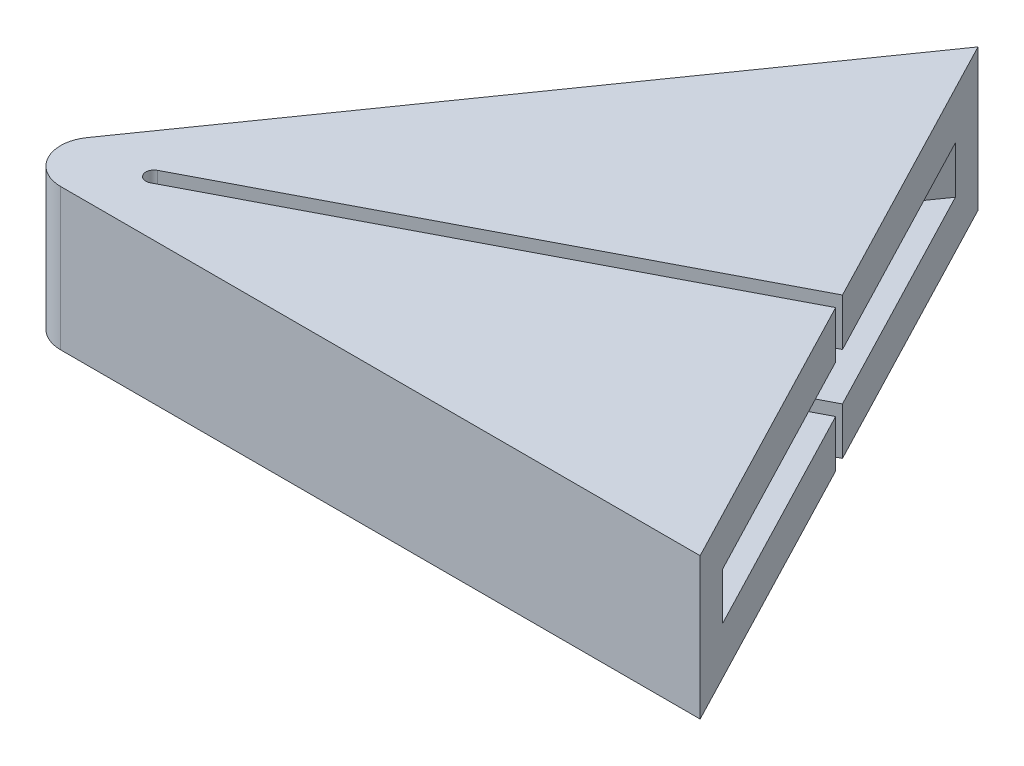
ISO-10303-21;
HEADER;
FILE_DESCRIPTION(('STEP AP214'),'2;1');
FILE_NAME('part.step','',(''),(''),'','','');
FILE_SCHEMA(('AUTOMOTIVE_DESIGN { 1 0 10303 214 1 1 1 1 }'));
ENDSEC;
DATA;
#1=APPLICATION_CONTEXT('core data for automotive mechanical design processes');
#2=APPLICATION_PROTOCOL_DEFINITION('international standard','automotive_design',2000,#1);
#3=PRODUCT_CONTEXT('',#1,'mechanical');
#4=PRODUCT('Part','Part','',(#3));
#5=PRODUCT_RELATED_PRODUCT_CATEGORY('part','',(#4));
#6=PRODUCT_DEFINITION_FORMATION('','',#4);
#7=PRODUCT_DEFINITION_CONTEXT('part definition',#1,'design');
#8=PRODUCT_DEFINITION('design','',#6,#7);
#9=PRODUCT_DEFINITION_SHAPE('','',#8);
#10=(LENGTH_UNIT() NAMED_UNIT(*) SI_UNIT(.MILLI.,.METRE.));
#11=(NAMED_UNIT(*) PLANE_ANGLE_UNIT() SI_UNIT($,.RADIAN.));
#12=(NAMED_UNIT(*) SI_UNIT($,.STERADIAN.) SOLID_ANGLE_UNIT());
#13=UNCERTAINTY_MEASURE_WITH_UNIT(LENGTH_MEASURE(1.E-05),#10,'distance_accuracy_value','');
#14=(GEOMETRIC_REPRESENTATION_CONTEXT(3) GLOBAL_UNCERTAINTY_ASSIGNED_CONTEXT((#13)) GLOBAL_UNIT_ASSIGNED_CONTEXT((#10,
#11,#12)) REPRESENTATION_CONTEXT('',''));
#15=CARTESIAN_POINT('',(0.,0.,0.));
#16=DIRECTION('',(0.,0.,1.));
#17=DIRECTION('',(1.,0.,0.));
#18=AXIS2_PLACEMENT_3D('',#15,#16,#17);
#19=CARTESIAN_POINT('',(23.761653898545,6.,-11.9837513627552));
#20=DIRECTION('',(-0.887010833178221,0.,0.461748613235035));
#21=DIRECTION('',(0.461748613235035,0.,0.887010833178221));
#22=AXIS2_PLACEMENT_3D('',#19,#20,#21);
#23=PLANE('',#22);
#24=DIRECTION('',(-0.461748613235035,0.,-0.887010833178221));
#25=VECTOR('',#24,1.);
#26=CARTESIAN_POINT('',(23.761653898545,2.,-11.9837513627552));
#27=LINE('',#26,#25);
#28=CARTESIAN_POINT('',(28.9588658988965,2.,-2.));
#29=VERTEX_POINT('',#28);
#30=CARTESIAN_POINT('',(23.761653898545,2.,-11.9837513627552));
#31=VERTEX_POINT('',#30);
#32=EDGE_CURVE('E179',#29,#31,#27,.T.);
#33=ORIENTED_EDGE('',*,*,#32,.F.);
#34=DIRECTION('',(0.,-1.,0.));
#35=VECTOR('',#34,1.);
#36=CARTESIAN_POINT('',(28.9588658988965,6.,-2.));
#37=LINE('',#36,#35);
#38=CARTESIAN_POINT('',(28.9588658988965,4.,-2.));
#39=VERTEX_POINT('',#38);
#40=EDGE_CURVE('E161',#39,#29,#37,.T.);
#41=ORIENTED_EDGE('',*,*,#40,.F.);
#42=DIRECTION('',(-0.461748613235035,0.,-0.887010833178221));
#43=VECTOR('',#42,1.);
#44=CARTESIAN_POINT('',(23.761653898545,4.,-11.9837513627552));
#45=LINE('',#44,#43);
#46=CARTESIAN_POINT('',(23.761653898545,4.,-11.9837513627552));
#47=VERTEX_POINT('',#46);
#48=EDGE_CURVE('E205',#39,#47,#45,.T.);
#49=ORIENTED_EDGE('',*,*,#48,.T.);
#50=DIRECTION('',(0.,-1.,0.));
#51=VECTOR('',#50,1.);
#52=CARTESIAN_POINT('',(23.761653898545,6.,-11.9837513627552));
#53=LINE('',#52,#51);
#54=CARTESIAN_POINT('',(23.761653898545,6.,-11.9837513627552));
#55=VERTEX_POINT('',#54);
#56=EDGE_CURVE('E304',#55,#47,#53,.T.);
#57=ORIENTED_EDGE('',*,*,#56,.F.);
#58=DIRECTION('',(-0.461748613235035,0.,-0.887010833178221));
#59=VECTOR('',#58,1.);
#60=CARTESIAN_POINT('',(23.761653898545,6.,-11.9837513627552));
#61=LINE('',#60,#59);
#62=CARTESIAN_POINT('',(30.,6.,0.));
#63=VERTEX_POINT('',#62);
#64=EDGE_CURVE('E244',#63,#55,#61,.T.);
#65=ORIENTED_EDGE('',*,*,#64,.F.);
#66=DIRECTION('',(0.,-1.,0.));
#67=VECTOR('',#66,1.);
#68=CARTESIAN_POINT('',(30.,6.,0.));
#69=LINE('',#68,#67);
#70=CARTESIAN_POINT('',(30.,0.,0.));
#71=VERTEX_POINT('',#70);
#72=EDGE_CURVE('E308',#63,#71,#69,.T.);
#73=ORIENTED_EDGE('',*,*,#72,.T.);
#74=DIRECTION('',(-0.461748613235035,0.,-0.887010833178221));
#75=VECTOR('',#74,1.);
#76=CARTESIAN_POINT('',(23.761653898545,0.,-11.9837513627552));
#77=LINE('',#76,#75);
#78=CARTESIAN_POINT('',(23.761653898545,0.,-11.9837513627552));
#79=VERTEX_POINT('',#78);
#80=EDGE_CURVE('E266',#71,#79,#77,.T.);
#81=ORIENTED_EDGE('',*,*,#80,.T.);
#82=EDGE_CURVE('E186',#31,#79,#53,.T.);
#83=ORIENTED_EDGE('',*,*,#82,.F.);
#84=EDGE_LOOP('',(#33,#41,#49,#57,#65,#73,#81,#83));
#85=FACE_BOUND('',#84,.T.);
#86=ADVANCED_FACE('F47',(#85),#23,.F.);
#87=CARTESIAN_POINT('',(4.6573191181392,6.,-2.0386641533662));
#88=DIRECTION('',(0.461748613235035,0.,0.887010833178221));
#89=DIRECTION('',(0.887010833178221,0.,-0.461748613235035));
#90=AXIS2_PLACEMENT_3D('',#87,#88,#89);
#91=PLANE('',#90);
#92=DIRECTION('',(-0.887010833178221,0.,0.461748613235035));
#93=VECTOR('',#92,1.);
#94=CARTESIAN_POINT('',(4.6573191181392,2.,-2.0386641533662));
#95=LINE('',#94,#93);
#96=CARTESIAN_POINT('',(4.6573191181392,2.,-2.0386641533662));
#97=VERTEX_POINT('',#96);
#98=EDGE_CURVE('E188',#31,#97,#95,.T.);
#99=ORIENTED_EDGE('',*,*,#98,.F.);
#100=ORIENTED_EDGE('',*,*,#82,.T.);
#101=DIRECTION('',(-0.887010833178221,0.,0.461748613235035));
#102=VECTOR('',#101,1.);
#103=CARTESIAN_POINT('',(4.6573191181392,0.,-2.0386641533662));
#104=LINE('',#103,#102);
#105=CARTESIAN_POINT('',(4.6573191181392,0.,-2.0386641533662));
#106=VERTEX_POINT('',#105);
#107=EDGE_CURVE('E269',#79,#106,#104,.T.);
#108=ORIENTED_EDGE('',*,*,#107,.T.);
#109=DIRECTION('',(0.,-1.,0.));
#110=VECTOR('',#109,1.);
#111=CARTESIAN_POINT('',(4.6573191181392,6.,-2.0386641533662));
#112=LINE('',#111,#110);
#113=EDGE_CURVE('E299',#97,#106,#112,.T.);
#114=ORIENTED_EDGE('',*,*,#113,.F.);
#115=EDGE_LOOP('',(#99,#100,#108,#114));
#116=FACE_BOUND('',#115,.T.);
#117=ADVANCED_FACE('F381',(#116),#91,.F.);
#118=CARTESIAN_POINT('',(23.4456391919863,6.,-12.5908099659146));
#119=DIRECTION('',(-0.461748613235035,0.,-0.887010833178221));
#120=DIRECTION('',(-0.887010833178221,0.,0.461748613235035));
#121=AXIS2_PLACEMENT_3D('',#118,#119,#120);
#122=PLANE('',#121);
#123=DIRECTION('',(0.887010833178221,0.,-0.461748613235035));
#124=VECTOR('',#123,1.);
#125=CARTESIAN_POINT('',(23.4456391919863,2.,-12.5908099659146));
#126=LINE('',#125,#124);
#127=CARTESIAN_POINT('',(4.34130441158048,2.,-2.64572275652553));
#128=VERTEX_POINT('',#127);
#129=CARTESIAN_POINT('',(23.4456391919863,2.,-12.5908099659146));
#130=VERTEX_POINT('',#129);
#131=EDGE_CURVE('E191',#128,#130,#126,.T.);
#132=ORIENTED_EDGE('',*,*,#131,.F.);
#133=DIRECTION('',(0.,-1.,0.));
#134=VECTOR('',#133,1.);
#135=CARTESIAN_POINT('',(4.34130441158048,6.,-2.64572275652553));
#136=LINE('',#135,#134);
#137=CARTESIAN_POINT('',(4.34130441158048,0.,-2.64572275652553));
#138=VERTEX_POINT('',#137);
#139=EDGE_CURVE('E294',#128,#138,#136,.T.);
#140=ORIENTED_EDGE('',*,*,#139,.T.);
#141=DIRECTION('',(0.887010833178221,0.,-0.461748613235035));
#142=VECTOR('',#141,1.);
#143=CARTESIAN_POINT('',(23.4456391919863,0.,-12.5908099659146));
#144=LINE('',#143,#142);
#145=CARTESIAN_POINT('',(23.4456391919863,0.,-12.5908099659146));
#146=VERTEX_POINT('',#145);
#147=EDGE_CURVE('E277',#138,#146,#144,.T.);
#148=ORIENTED_EDGE('',*,*,#147,.T.);
#149=DIRECTION('',(0.,-1.,0.));
#150=VECTOR('',#149,1.);
#151=CARTESIAN_POINT('',(23.4456391919863,6.,-12.5908099659146));
#152=LINE('',#151,#150);
#153=EDGE_CURVE('E289',#130,#146,#152,.T.);
#154=ORIENTED_EDGE('',*,*,#153,.F.);
#155=EDGE_LOOP('',(#132,#140,#148,#154));
#156=FACE_BOUND('',#155,.T.);
#157=ADVANCED_FACE('F385',(#156),#122,.F.);
#158=CARTESIAN_POINT('',(17.2072930905313,6.,-24.5745613286698));
#159=DIRECTION('',(-0.887010833178221,0.,0.461748613235035));
#160=DIRECTION('',(0.461748613235035,0.,0.887010833178221));
#161=AXIS2_PLACEMENT_3D('',#158,#159,#160);
#162=PLANE('',#161);
#163=DIRECTION('',(-0.461748613235035,0.,-0.887010833178221));
#164=VECTOR('',#163,1.);
#165=CARTESIAN_POINT('',(17.2072930905313,2.,-24.5745613286698));
#166=LINE('',#165,#164);
#167=CARTESIAN_POINT('',(18.2484271916348,2.,-22.5745613286698));
#168=VERTEX_POINT('',#167);
#169=EDGE_CURVE('E227',#130,#168,#166,.T.);
#170=ORIENTED_EDGE('',*,*,#169,.F.);
#171=ORIENTED_EDGE('',*,*,#153,.T.);
#172=DIRECTION('',(-0.461748613235035,0.,-0.887010833178221));
#173=VECTOR('',#172,1.);
#174=CARTESIAN_POINT('',(17.2072930905313,0.,-24.5745613286698));
#175=LINE('',#174,#173);
#176=CARTESIAN_POINT('',(17.2072930905313,0.,-24.5745613286698));
#177=VERTEX_POINT('',#176);
#178=EDGE_CURVE('E281',#146,#177,#175,.T.);
#179=ORIENTED_EDGE('',*,*,#178,.T.);
#180=DIRECTION('',(0.,-1.,0.));
#181=VECTOR('',#180,1.);
#182=CARTESIAN_POINT('',(17.2072930905313,6.,-24.5745613286698));
#183=LINE('',#182,#181);
#184=CARTESIAN_POINT('',(17.2072930905313,6.,-24.5745613286698));
#185=VERTEX_POINT('',#184);
#186=EDGE_CURVE('E263',#185,#177,#183,.T.);
#187=ORIENTED_EDGE('',*,*,#186,.F.);
#188=DIRECTION('',(-0.461748613235035,0.,-0.887010833178221));
#189=VECTOR('',#188,1.);
#190=CARTESIAN_POINT('',(17.2072930905313,6.,-24.5745613286698));
#191=LINE('',#190,#189);
#192=CARTESIAN_POINT('',(23.4456391919863,6.,-12.5908099659146));
#193=VERTEX_POINT('',#192);
#194=EDGE_CURVE('E257',#193,#185,#191,.T.);
#195=ORIENTED_EDGE('',*,*,#194,.F.);
#196=CARTESIAN_POINT('',(23.4456391919863,4.,-12.5908099659146));
#197=VERTEX_POINT('',#196);
#198=EDGE_CURVE('E290',#193,#197,#152,.T.);
#199=ORIENTED_EDGE('',*,*,#198,.T.);
#200=DIRECTION('',(-0.461748613235035,0.,-0.887010833178221));
#201=VECTOR('',#200,1.);
#202=CARTESIAN_POINT('',(17.2072930905313,4.,-24.5745613286698));
#203=LINE('',#202,#201);
#204=CARTESIAN_POINT('',(18.2484271916348,4.,-22.5745613286698));
#205=VERTEX_POINT('',#204);
#206=EDGE_CURVE('E214',#197,#205,#203,.T.);
#207=ORIENTED_EDGE('',*,*,#206,.T.);
#208=DIRECTION('',(0.,-1.,0.));
#209=VECTOR('',#208,1.);
#210=CARTESIAN_POINT('',(18.2484271916348,6.,-22.5745613286698));
#211=LINE('',#210,#209);
#212=EDGE_CURVE('E208',#205,#168,#211,.T.);
#213=ORIENTED_EDGE('',*,*,#212,.T.);
#214=EDGE_LOOP('',(#170,#171,#179,#187,#195,#199,#207,#213));
#215=FACE_BOUND('',#214,.T.);
#216=ADVANCED_FACE('F387',(#215),#162,.F.);
#217=CARTESIAN_POINT('',(0.,6.,0.));
#218=DIRECTION('',(0.,0.,-1.));
#219=DIRECTION('',(-1.,0.,0.));
#220=AXIS2_PLACEMENT_3D('',#217,#218,#219);
#221=PLANE('',#220);
#222=DIRECTION('',(1.,0.,0.));
#223=VECTOR('',#222,1.);
#224=CARTESIAN_POINT('',(0.,6.,0.));
#225=LINE('',#224,#223);
#226=CARTESIAN_POINT('',(2.88147319045674,6.,0.));
#227=VERTEX_POINT('',#226);
#228=EDGE_CURVE('E241',#227,#63,#225,.T.);
#229=ORIENTED_EDGE('',*,*,#228,.F.);
#230=DIRECTION('',(0.,-1.,0.));
#231=VECTOR('',#230,1.);
#232=CARTESIAN_POINT('',(2.88147319045674,6.,0.));
#233=LINE('',#232,#231);
#234=CARTESIAN_POINT('',(2.88147319045674,0.,0.));
#235=VERTEX_POINT('',#234);
#236=EDGE_CURVE('E312',#227,#235,#233,.T.);
#237=ORIENTED_EDGE('',*,*,#236,.T.);
#238=DIRECTION('',(1.,0.,0.));
#239=VECTOR('',#238,1.);
#240=CARTESIAN_POINT('',(0.,0.,0.));
#241=LINE('',#240,#239);
#242=EDGE_CURVE('E240',#235,#71,#241,.T.);
#243=ORIENTED_EDGE('',*,*,#242,.T.);
#244=ORIENTED_EDGE('',*,*,#72,.F.);
#245=EDGE_LOOP('',(#229,#237,#243,#244));
#246=FACE_BOUND('',#245,.T.);
#247=ADVANCED_FACE('F372',(#246),#221,.F.);
#248=ORIENTED_EDGE('',*,*,#56,.T.);
#249=DIRECTION('',(-0.887010833178221,0.,0.461748613235035));
#250=VECTOR('',#249,1.);
#251=CARTESIAN_POINT('',(4.6573191181392,4.,-2.0386641533662));
#252=LINE('',#251,#250);
#253=CARTESIAN_POINT('',(4.6573191181392,4.,-2.0386641533662));
#254=VERTEX_POINT('',#253);
#255=EDGE_CURVE('E200',#47,#254,#252,.T.);
#256=ORIENTED_EDGE('',*,*,#255,.T.);
#257=CARTESIAN_POINT('',(4.6573191181392,6.,-2.0386641533662));
#258=VERTEX_POINT('',#257);
#259=EDGE_CURVE('E300',#258,#254,#112,.T.);
#260=ORIENTED_EDGE('',*,*,#259,.F.);
#261=DIRECTION('',(-0.887010833178221,0.,0.461748613235035));
#262=VECTOR('',#261,1.);
#263=CARTESIAN_POINT('',(4.6573191181392,6.,-2.0386641533662));
#264=LINE('',#263,#262);
#265=EDGE_CURVE('E248',#55,#258,#264,.T.);
#266=ORIENTED_EDGE('',*,*,#265,.F.);
#267=EDGE_LOOP('',(#248,#256,#260,#266));
#268=FACE_BOUND('',#267,.T.);
#269=ADVANCED_FACE('F363',(#268),#91,.F.);
#270=CARTESIAN_POINT('',(4.49931176485984,6.,-2.34219345494587));
#271=DIRECTION('',(0.,-1.,0.));
#272=DIRECTION('',(0.,0.,-1.));
#273=AXIS2_PLACEMENT_3D('',#270,#271,#272);
#274=CYLINDRICAL_SURFACE('',#273,0.342193454945866);
#275=CARTESIAN_POINT('',(4.49931176485984,0.,-2.34219345494587));
#276=DIRECTION('',(0.,-1.,0.));
#277=DIRECTION('',(0.,0.,1.));
#278=AXIS2_PLACEMENT_3D('',#275,#276,#277);
#279=CIRCLE('',#278,0.342193454945866);
#280=EDGE_CURVE('E273',#106,#138,#279,.T.);
#281=ORIENTED_EDGE('',*,*,#280,.T.);
#282=ORIENTED_EDGE('',*,*,#139,.F.);
#283=DIRECTION('',(0.,-1.,0.));
#284=VECTOR('',#283,1.);
#285=CARTESIAN_POINT('',(4.34130441158048,6.,-2.64572275652553));
#286=LINE('',#285,#284);
#287=CARTESIAN_POINT('',(4.34130441158048,4.,-2.64572275652553));
#288=VERTEX_POINT('',#287);
#289=EDGE_CURVE('E212',#288,#128,#286,.T.);
#290=ORIENTED_EDGE('',*,*,#289,.F.);
#291=CARTESIAN_POINT('',(4.34130441158048,6.,-2.64572275652553));
#292=VERTEX_POINT('',#291);
#293=EDGE_CURVE('E295',#292,#288,#136,.T.);
#294=ORIENTED_EDGE('',*,*,#293,.F.);
#295=CARTESIAN_POINT('',(4.49931176485984,6.,-2.34219345494587));
#296=DIRECTION('',(0.,-1.,0.));
#297=DIRECTION('',(0.,0.,1.));
#298=AXIS2_PLACEMENT_3D('',#295,#296,#297);
#299=CIRCLE('',#298,0.342193454945866);
#300=EDGE_CURVE('E251',#258,#292,#299,.T.);
#301=ORIENTED_EDGE('',*,*,#300,.F.);
#302=ORIENTED_EDGE('',*,*,#259,.T.);
#303=DIRECTION('',(0.,-1.,0.));
#304=VECTOR('',#303,1.);
#305=CARTESIAN_POINT('',(4.6573191181392,6.,-2.0386641533662));
#306=LINE('',#305,#304);
#307=EDGE_CURVE('E173',#254,#97,#306,.T.);
#308=ORIENTED_EDGE('',*,*,#307,.T.);
#309=ORIENTED_EDGE('',*,*,#113,.T.);
#310=EDGE_LOOP('',(#281,#282,#290,#294,#301,#302,#308,#309));
#311=FACE_BOUND('',#310,.T.);
#312=ADVANCED_FACE('F349',(#311),#274,.F.);
#313=ORIENTED_EDGE('',*,*,#293,.T.);
#314=DIRECTION('',(0.887010833178221,0.,-0.461748613235035));
#315=VECTOR('',#314,1.);
#316=CARTESIAN_POINT('',(23.4456391919863,4.,-12.5908099659146));
#317=LINE('',#316,#315);
#318=EDGE_CURVE('E204',#288,#197,#317,.T.);
#319=ORIENTED_EDGE('',*,*,#318,.T.);
#320=ORIENTED_EDGE('',*,*,#198,.F.);
#321=DIRECTION('',(0.887010833178221,0.,-0.461748613235035));
#322=VECTOR('',#321,1.);
#323=CARTESIAN_POINT('',(23.4456391919863,6.,-12.5908099659146));
#324=LINE('',#323,#322);
#325=EDGE_CURVE('E254',#292,#193,#324,.T.);
#326=ORIENTED_EDGE('',*,*,#325,.F.);
#327=EDGE_LOOP('',(#313,#319,#320,#326));
#328=FACE_BOUND('',#327,.T.);
#329=ADVANCED_FACE('F353',(#328),#122,.F.);
#330=CARTESIAN_POINT('',(0.,6.,0.));
#331=DIRECTION('',(0.819152044288993,0.,0.573576436351044));
#332=DIRECTION('',(0.573576436351044,0.,-0.819152044288993));
#333=AXIS2_PLACEMENT_3D('',#330,#331,#332);
#334=PLANE('',#333);
#335=DIRECTION('',(-0.573576436351044,0.,0.819152044288993));
#336=VECTOR('',#335,1.);
#337=CARTESIAN_POINT('',(0.,0.,0.));
#338=LINE('',#337,#336);
#339=CARTESIAN_POINT('',(1.65274512402325,0.,-2.36036465452657));
#340=VERTEX_POINT('',#339);
#341=EDGE_CURVE('E245',#177,#340,#338,.T.);
#342=ORIENTED_EDGE('',*,*,#341,.T.);
#343=DIRECTION('',(0.,-1.,0.));
#344=VECTOR('',#343,1.);
#345=CARTESIAN_POINT('',(1.65274512402325,6.,-2.36036465452657));
#346=LINE('',#345,#344);
#347=CARTESIAN_POINT('',(1.65274512402325,6.,-2.36036465452657));
#348=VERTEX_POINT('',#347);
#349=EDGE_CURVE('E56',#340,#348,#346,.F.);
#350=ORIENTED_EDGE('',*,*,#349,.T.);
#351=DIRECTION('',(-0.573576436351044,0.,0.819152044288993));
#352=VECTOR('',#351,1.);
#353=CARTESIAN_POINT('',(0.,6.,0.));
#354=LINE('',#353,#352);
#355=EDGE_CURVE('E260',#185,#348,#354,.T.);
#356=ORIENTED_EDGE('',*,*,#355,.F.);
#357=ORIENTED_EDGE('',*,*,#186,.T.);
#358=EDGE_LOOP('',(#342,#350,#356,#357));
#359=FACE_BOUND('',#358,.T.);
#360=ADVANCED_FACE('F421',(#359),#334,.F.);
#361=CARTESIAN_POINT('',(4.49931176485984,6.,-2.34219345494587));
#362=DIRECTION('',(0.,1.,0.));
#363=DIRECTION('',(0.,0.,1.));
#364=AXIS2_PLACEMENT_3D('',#361,#362,#363);
#365=PLANE('',#364);
#366=ORIENTED_EDGE('',*,*,#355,.T.);
#367=CARTESIAN_POINT('',(2.88147319045674,6.,-1.5));
#368=DIRECTION('',(0.,1.,0.));
#369=DIRECTION('',(0.,0.,1.));
#370=AXIS2_PLACEMENT_3D('',#367,#368,#369);
#371=CIRCLE('',#370,1.5);
#372=EDGE_CURVE('E11',#348,#227,#371,.T.);
#373=ORIENTED_EDGE('',*,*,#372,.T.);
#374=ORIENTED_EDGE('',*,*,#228,.T.);
#375=ORIENTED_EDGE('',*,*,#64,.T.);
#376=ORIENTED_EDGE('',*,*,#265,.T.);
#377=ORIENTED_EDGE('',*,*,#300,.T.);
#378=ORIENTED_EDGE('',*,*,#325,.T.);
#379=ORIENTED_EDGE('',*,*,#194,.T.);
#380=EDGE_LOOP('',(#366,#373,#374,#375,#376,#377,#378,#379));
#381=FACE_BOUND('',#380,.T.);
#382=ADVANCED_FACE('F357',(#381),#365,.T.);
#383=CARTESIAN_POINT('',(4.49931176485984,0.,-2.34219345494587));
#384=DIRECTION('',(0.,1.,0.));
#385=DIRECTION('',(0.,0.,1.));
#386=AXIS2_PLACEMENT_3D('',#383,#384,#385);
#387=PLANE('',#386);
#388=ORIENTED_EDGE('',*,*,#242,.F.);
#389=CARTESIAN_POINT('',(2.88147319045674,0.,-1.5));
#390=DIRECTION('',(0.,1.,0.));
#391=DIRECTION('',(0.,0.,1.));
#392=AXIS2_PLACEMENT_3D('',#389,#390,#391);
#393=CIRCLE('',#392,1.5);
#394=EDGE_CURVE('E70',#235,#340,#393,.F.);
#395=ORIENTED_EDGE('',*,*,#394,.T.);
#396=ORIENTED_EDGE('',*,*,#341,.F.);
#397=ORIENTED_EDGE('',*,*,#178,.F.);
#398=ORIENTED_EDGE('',*,*,#147,.F.);
#399=ORIENTED_EDGE('',*,*,#280,.F.);
#400=ORIENTED_EDGE('',*,*,#107,.F.);
#401=ORIENTED_EDGE('',*,*,#80,.F.);
#402=EDGE_LOOP('',(#388,#395,#396,#397,#398,#399,#400,#401));
#403=FACE_BOUND('',#402,.T.);
#404=ADVANCED_FACE('F376',(#403),#387,.F.);
#405=CARTESIAN_POINT('',(4.34130441158048,6.,-2.64572275652553));
#406=DIRECTION('',(0.887010833178221,0.,-0.461748613235035));
#407=DIRECTION('',(0.,-1.,0.));
#408=AXIS2_PLACEMENT_3D('',#405,#406,#407);
#409=PLANE('',#408);
#410=DIRECTION('',(-0.461748613235035,0.,-0.887010833178221));
#411=VECTOR('',#410,1.);
#412=CARTESIAN_POINT('',(4.49931176485984,4.,-2.34219345494587));
#413=LINE('',#412,#411);
#414=CARTESIAN_POINT('',(4.32117712730056,4.,-2.68438690989173));
#415=VERTEX_POINT('',#414);
#416=EDGE_CURVE('E221',#415,#288,#413,.F.);
#417=ORIENTED_EDGE('',*,*,#416,.T.);
#418=ORIENTED_EDGE('',*,*,#289,.T.);
#419=DIRECTION('',(0.461748613235035,0.,0.887010833178221));
#420=VECTOR('',#419,1.);
#421=CARTESIAN_POINT('',(4.34130441158048,2.,-2.64572275652553));
#422=LINE('',#421,#420);
#423=CARTESIAN_POINT('',(4.32117712730056,2.,-2.68438690989173));
#424=VERTEX_POINT('',#423);
#425=EDGE_CURVE('E197',#424,#128,#422,.T.);
#426=ORIENTED_EDGE('',*,*,#425,.F.);
#427=DIRECTION('',(0.,1.,0.));
#428=VECTOR('',#427,1.);
#429=CARTESIAN_POINT('',(4.32117712730056,6.,-2.68438690989173));
#430=LINE('',#429,#428);
#431=EDGE_CURVE('E237',#415,#424,#430,.F.);
#432=ORIENTED_EDGE('',*,*,#431,.F.);
#433=EDGE_LOOP('',(#417,#418,#426,#432));
#434=FACE_BOUND('',#433,.T.);
#435=ADVANCED_FACE('F342',(#434),#409,.T.);
#436=CARTESIAN_POINT('',(1.63830408857799,6.,1.14715287270209));
#437=DIRECTION('',(0.819152044288993,0.,0.573576436351044));
#438=DIRECTION('',(0.573576436351044,0.,-0.819152044288993));
#439=AXIS2_PLACEMENT_3D('',#436,#437,#438);
#440=PLANE('',#439);
#441=ORIENTED_EDGE('',*,*,#431,.T.);
#442=DIRECTION('',(-0.573576436351044,0.,0.819152044288993));
#443=VECTOR('',#442,1.);
#444=CARTESIAN_POINT('',(1.63830408857799,2.,1.14715287270209));
#445=LINE('',#444,#443);
#446=EDGE_CURVE('E231',#168,#424,#445,.T.);
#447=ORIENTED_EDGE('',*,*,#446,.F.);
#448=ORIENTED_EDGE('',*,*,#212,.F.);
#449=DIRECTION('',(-0.573576436351044,0.,0.819152044288993));
#450=VECTOR('',#449,1.);
#451=CARTESIAN_POINT('',(1.63830408857799,4.,1.14715287270209));
#452=LINE('',#451,#450);
#453=EDGE_CURVE('E213',#205,#415,#452,.T.);
#454=ORIENTED_EDGE('',*,*,#453,.T.);
#455=EDGE_LOOP('',(#441,#447,#448,#454));
#456=FACE_BOUND('',#455,.T.);
#457=ADVANCED_FACE('F388',(#456),#440,.T.);
#458=CARTESIAN_POINT('',(4.49931176485984,4.,-2.34219345494587));
#459=DIRECTION('',(0.,1.,0.));
#460=DIRECTION('',(0.,0.,1.));
#461=AXIS2_PLACEMENT_3D('',#458,#459,#460);
#462=PLANE('',#461);
#463=ORIENTED_EDGE('',*,*,#453,.F.);
#464=ORIENTED_EDGE('',*,*,#206,.F.);
#465=ORIENTED_EDGE('',*,*,#318,.F.);
#466=ORIENTED_EDGE('',*,*,#416,.F.);
#467=EDGE_LOOP('',(#463,#464,#465,#466));
#468=FACE_BOUND('',#467,.T.);
#469=ADVANCED_FACE('F390',(#468),#462,.F.);
#470=CARTESIAN_POINT('',(4.49931176485984,2.,-2.34219345494587));
#471=DIRECTION('',(0.,1.,0.));
#472=DIRECTION('',(0.,0.,1.));
#473=AXIS2_PLACEMENT_3D('',#470,#471,#472);
#474=PLANE('',#473);
#475=ORIENTED_EDGE('',*,*,#425,.T.);
#476=ORIENTED_EDGE('',*,*,#131,.T.);
#477=ORIENTED_EDGE('',*,*,#169,.T.);
#478=ORIENTED_EDGE('',*,*,#446,.T.);
#479=EDGE_LOOP('',(#475,#476,#477,#478));
#480=FACE_BOUND('',#479,.T.);
#481=ADVANCED_FACE('F336',(#480),#474,.T.);
#482=CARTESIAN_POINT('',(0.,6.,-2.));
#483=DIRECTION('',(0.,0.,-1.));
#484=DIRECTION('',(-1.,0.,0.));
#485=AXIS2_PLACEMENT_3D('',#482,#483,#484);
#486=PLANE('',#485);
#487=DIRECTION('',(1.,0.,0.));
#488=VECTOR('',#487,1.);
#489=CARTESIAN_POINT('',(0.,4.,-2.));
#490=LINE('',#489,#488);
#491=CARTESIAN_POINT('',(4.67744640241912,4.,-2.));
#492=VERTEX_POINT('',#491);
#493=EDGE_CURVE('E166',#492,#39,#490,.T.);
#494=ORIENTED_EDGE('',*,*,#493,.T.);
#495=ORIENTED_EDGE('',*,*,#40,.T.);
#496=DIRECTION('',(1.,0.,0.));
#497=VECTOR('',#496,1.);
#498=CARTESIAN_POINT('',(0.,2.,-2.));
#499=LINE('',#498,#497);
#500=CARTESIAN_POINT('',(4.67744640241912,2.,-2.));
#501=VERTEX_POINT('',#500);
#502=EDGE_CURVE('E164',#501,#29,#499,.T.);
#503=ORIENTED_EDGE('',*,*,#502,.F.);
#504=DIRECTION('',(0.,-1.,0.));
#505=VECTOR('',#504,1.);
#506=CARTESIAN_POINT('',(4.67744640241912,6.,-2.));
#507=LINE('',#506,#505);
#508=EDGE_CURVE('E224',#492,#501,#507,.T.);
#509=ORIENTED_EDGE('',*,*,#508,.F.);
#510=EDGE_LOOP('',(#494,#495,#503,#509));
#511=FACE_BOUND('',#510,.T.);
#512=ADVANCED_FACE('F163',(#511),#486,.T.);
#513=CARTESIAN_POINT('',(4.6573191181392,6.,-2.0386641533662));
#514=DIRECTION('',(-0.887010833178221,0.,0.461748613235035));
#515=DIRECTION('',(0.,-1.,0.));
#516=AXIS2_PLACEMENT_3D('',#513,#514,#515);
#517=PLANE('',#516);
#518=ORIENTED_EDGE('',*,*,#508,.T.);
#519=DIRECTION('',(-0.461748613235035,0.,-0.887010833178221));
#520=VECTOR('',#519,1.);
#521=CARTESIAN_POINT('',(4.6573191181392,2.,-2.0386641533662));
#522=LINE('',#521,#520);
#523=EDGE_CURVE('E181',#501,#97,#522,.T.);
#524=ORIENTED_EDGE('',*,*,#523,.T.);
#525=ORIENTED_EDGE('',*,*,#307,.F.);
#526=DIRECTION('',(-0.461748613235035,0.,-0.887010833178221));
#527=VECTOR('',#526,1.);
#528=CARTESIAN_POINT('',(4.6573191181392,4.,-2.0386641533662));
#529=LINE('',#528,#527);
#530=EDGE_CURVE('E172',#492,#254,#529,.T.);
#531=ORIENTED_EDGE('',*,*,#530,.F.);
#532=EDGE_LOOP('',(#518,#524,#525,#531));
#533=FACE_BOUND('',#532,.T.);
#534=ADVANCED_FACE('F400',(#533),#517,.F.);
#535=ORIENTED_EDGE('',*,*,#530,.T.);
#536=ORIENTED_EDGE('',*,*,#255,.F.);
#537=ORIENTED_EDGE('',*,*,#48,.F.);
#538=ORIENTED_EDGE('',*,*,#493,.F.);
#539=EDGE_LOOP('',(#535,#536,#537,#538));
#540=FACE_BOUND('',#539,.T.);
#541=ADVANCED_FACE('F366',(#540),#462,.F.);
#542=ORIENTED_EDGE('',*,*,#502,.T.);
#543=ORIENTED_EDGE('',*,*,#32,.T.);
#544=ORIENTED_EDGE('',*,*,#98,.T.);
#545=ORIENTED_EDGE('',*,*,#523,.F.);
#546=EDGE_LOOP('',(#542,#543,#544,#545));
#547=FACE_BOUND('',#546,.T.);
#548=ADVANCED_FACE('F177',(#547),#474,.T.);
#549=CARTESIAN_POINT('',(2.88147319045674,6.,-1.5));
#550=DIRECTION('',(0.,-1.,0.));
#551=DIRECTION('',(0.,0.,-1.));
#552=AXIS2_PLACEMENT_3D('',#549,#550,#551);
#553=CYLINDRICAL_SURFACE('',#552,1.5);
#554=ORIENTED_EDGE('',*,*,#372,.F.);
#555=ORIENTED_EDGE('',*,*,#349,.F.);
#556=ORIENTED_EDGE('',*,*,#394,.F.);
#557=ORIENTED_EDGE('',*,*,#236,.F.);
#558=EDGE_LOOP('',(#554,#555,#556,#557));
#559=FACE_BOUND('',#558,.T.);
#560=ADVANCED_FACE('F49',(#559),#553,.T.);
#561=CLOSED_SHELL('',(#86,#117,#157,#216,#247,#269,#312,#329,#360,#382,#404,#435,#457,#469,#481,
#512,#534,#541,#548,#560));
#562=MANIFOLD_SOLID_BREP('B2',#561);
#563=ADVANCED_BREP_SHAPE_REPRESENTATION('',(#18,#562),#14);
#564=SHAPE_DEFINITION_REPRESENTATION(#9,#563);
ENDSEC;
END-ISO-10303-21;
